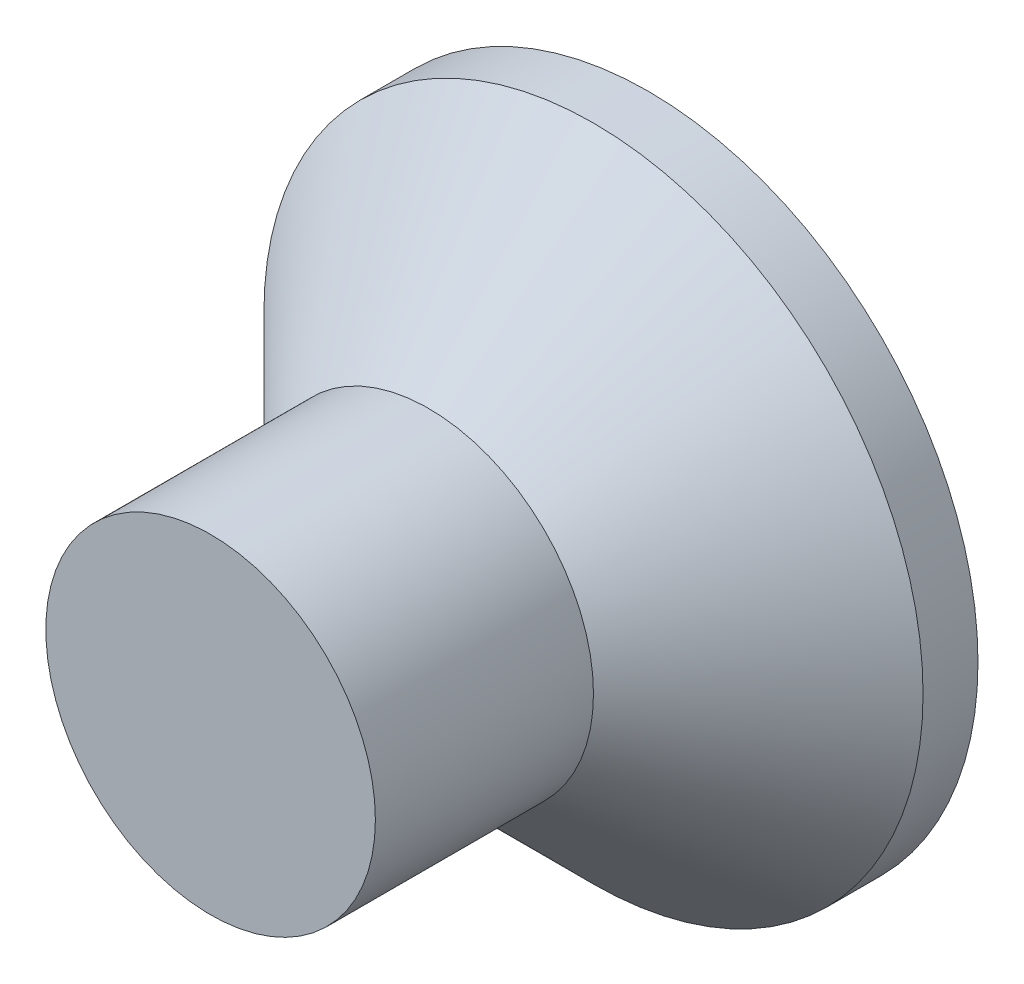
ISO-10303-21;
HEADER;
FILE_DESCRIPTION(('STEP AP214'),'2;1');
FILE_NAME('part.step','',(''),(''),'','','');
FILE_SCHEMA(('AUTOMOTIVE_DESIGN { 1 0 10303 214 1 1 1 1 }'));
ENDSEC;
DATA;
#1=APPLICATION_CONTEXT('core data for automotive mechanical design processes');
#2=APPLICATION_PROTOCOL_DEFINITION('international standard','automotive_design',2000,#1);
#3=PRODUCT_CONTEXT('',#1,'mechanical');
#4=PRODUCT('Part','Part','',(#3));
#5=PRODUCT_RELATED_PRODUCT_CATEGORY('part','',(#4));
#6=PRODUCT_DEFINITION_FORMATION('','',#4);
#7=PRODUCT_DEFINITION_CONTEXT('part definition',#1,'design');
#8=PRODUCT_DEFINITION('design','',#6,#7);
#9=PRODUCT_DEFINITION_SHAPE('','',#8);
#10=(LENGTH_UNIT() NAMED_UNIT(*) SI_UNIT(.MILLI.,.METRE.));
#11=(NAMED_UNIT(*) PLANE_ANGLE_UNIT() SI_UNIT($,.RADIAN.));
#12=(NAMED_UNIT(*) SI_UNIT($,.STERADIAN.) SOLID_ANGLE_UNIT());
#13=UNCERTAINTY_MEASURE_WITH_UNIT(LENGTH_MEASURE(1.E-05),#10,'distance_accuracy_value','');
#14=(GEOMETRIC_REPRESENTATION_CONTEXT(3) GLOBAL_UNCERTAINTY_ASSIGNED_CONTEXT((#13)) GLOBAL_UNIT_ASSIGNED_CONTEXT((#10,
#11,#12)) REPRESENTATION_CONTEXT('',''));
#15=CARTESIAN_POINT('',(0.,0.,0.));
#16=DIRECTION('',(0.,0.,1.));
#17=DIRECTION('',(1.,0.,0.));
#18=AXIS2_PLACEMENT_3D('',#15,#16,#17);
#19=CARTESIAN_POINT('',(0.,0.,6.95286377859827));
#20=DIRECTION('',(0.,0.,1.));
#21=DIRECTION('',(1.,0.,0.));
#22=AXIS2_PLACEMENT_3D('',#19,#20,#21);
#23=SPHERICAL_SURFACE('',#22,7.57247084667507);
#24=CARTESIAN_POINT('',(0.,0.,0.));
#25=DIRECTION('',(0.,0.,1.));
#26=DIRECTION('',(1.,0.,0.));
#27=AXIS2_PLACEMENT_3D('',#24,#25,#26);
#28=CIRCLE('',#27,3.);
#29=CARTESIAN_POINT('',(3.,0.,0.));
#30=VERTEX_POINT('',#29);
#31=EDGE_CURVE('E183',#30,#30,#28,.T.);
#32=ORIENTED_EDGE('',*,*,#31,.F.);
#33=EDGE_LOOP('',(#32));
#34=FACE_BOUND('',#33,.T.);
#35=CARTESIAN_POINT('',(0.,-1.29903810567666,6.95286377859827));
#36=DIRECTION('',(0.,1.,0.));
#37=DIRECTION('',(0.,0.,1.));
#38=AXIS2_PLACEMENT_3D('',#35,#36,#37);
#39=CIRCLE('',#38,7.46021546094641);
#40=CARTESIAN_POINT('',(-0.750000000000001,-1.29903810567666,-0.469555956484341));
#41=VERTEX_POINT('',#40);
#42=CARTESIAN_POINT('',(0.750000000000001,-1.29903810567666,-0.469555956484341));
#43=VERTEX_POINT('',#42);
#44=EDGE_CURVE('E113',#41,#43,#39,.F.);
#45=ORIENTED_EDGE('',*,*,#44,.T.);
#46=CARTESIAN_POINT('',(1.125,-0.649519052838329,6.95286377859827));
#47=DIRECTION('',(-0.866025403784439,0.5,0.));
#48=DIRECTION('',(-0.5,-0.866025403784439,0.));
#49=AXIS2_PLACEMENT_3D('',#46,#47,#48);
#50=CIRCLE('',#49,7.46021546094641);
#51=CARTESIAN_POINT('',(1.5,0.,-0.469555956484341));
#52=VERTEX_POINT('',#51);
#53=EDGE_CURVE('E132',#43,#52,#50,.F.);
#54=ORIENTED_EDGE('',*,*,#53,.T.);
#55=CARTESIAN_POINT('',(1.125,0.64951905283833,6.95286377859827));
#56=DIRECTION('',(-0.866025403784439,-0.5,0.));
#57=DIRECTION('',(0.5,-0.866025403784439,0.));
#58=AXIS2_PLACEMENT_3D('',#55,#56,#57);
#59=CIRCLE('',#58,7.46021546094641);
#60=CARTESIAN_POINT('',(0.75,1.29903810567666,-0.469555956484341));
#61=VERTEX_POINT('',#60);
#62=EDGE_CURVE('E129',#52,#61,#59,.F.);
#63=ORIENTED_EDGE('',*,*,#62,.T.);
#64=CARTESIAN_POINT('',(0.,1.29903810567666,6.95286377859827));
#65=DIRECTION('',(0.,-1.,0.));
#66=DIRECTION('',(0.,0.,-1.));
#67=AXIS2_PLACEMENT_3D('',#64,#65,#66);
#68=CIRCLE('',#67,7.46021546094641);
#69=CARTESIAN_POINT('',(-0.75,1.29903810567666,-0.469555956484341));
#70=VERTEX_POINT('',#69);
#71=EDGE_CURVE('E124',#61,#70,#68,.F.);
#72=ORIENTED_EDGE('',*,*,#71,.T.);
#73=CARTESIAN_POINT('',(-1.125,0.649519052838329,6.95286377859827));
#74=DIRECTION('',(0.866025403784439,-0.5,0.));
#75=DIRECTION('',(0.5,0.866025403784439,0.));
#76=AXIS2_PLACEMENT_3D('',#73,#74,#75);
#77=CIRCLE('',#76,7.46021546094641);
#78=CARTESIAN_POINT('',(-1.5,0.,-0.469555956484341));
#79=VERTEX_POINT('',#78);
#80=EDGE_CURVE('E122',#70,#79,#77,.F.);
#81=ORIENTED_EDGE('',*,*,#80,.T.);
#82=CARTESIAN_POINT('',(-1.125,-0.649519052838329,6.95286377859827));
#83=DIRECTION('',(0.866025403784439,0.5,0.));
#84=DIRECTION('',(-0.5,0.866025403784439,0.));
#85=AXIS2_PLACEMENT_3D('',#82,#83,#84);
#86=CIRCLE('',#85,7.46021546094641);
#87=EDGE_CURVE('E106',#79,#41,#86,.F.);
#88=ORIENTED_EDGE('',*,*,#87,.T.);
#89=EDGE_LOOP('',(#45,#54,#63,#72,#81,#88));
#90=FACE_BOUND('',#89,.T.);
#91=ADVANCED_FACE('F32',(#34,#90),#23,.T.);
#92=CARTESIAN_POINT('',(1.5,0.,3.98507993451573));
#93=DIRECTION('',(0.,0.,1.));
#94=DIRECTION('',(1.,0.,0.));
#95=AXIS2_PLACEMENT_3D('',#92,#93,#94);
#96=PLANE('',#95);
#97=CARTESIAN_POINT('',(0.,0.,3.98507993451573));
#98=DIRECTION('',(0.,0.,1.));
#99=DIRECTION('',(1.,0.,0.));
#100=AXIS2_PLACEMENT_3D('',#97,#98,#99);
#101=CIRCLE('',#100,1.5);
#102=CARTESIAN_POINT('',(1.5,0.,3.98507993451573));
#103=VERTEX_POINT('',#102);
#104=EDGE_CURVE('E118',#103,#103,#101,.T.);
#105=ORIENTED_EDGE('',*,*,#104,.T.);
#106=EDGE_LOOP('',(#105));
#107=FACE_BOUND('',#106,.T.);
#108=ADVANCED_FACE('F194',(#107),#96,.T.);
#109=CARTESIAN_POINT('',(0.,0.,3.98507993451573));
#110=DIRECTION('',(0.,0.,1.));
#111=DIRECTION('',(1.,0.,0.));
#112=AXIS2_PLACEMENT_3D('',#109,#110,#111);
#113=CYLINDRICAL_SURFACE('',#112,1.5);
#114=CARTESIAN_POINT('',(0.,0.,1.99999999999998));
#115=DIRECTION('',(0.,0.,1.));
#116=DIRECTION('',(1.,0.,0.));
#117=AXIS2_PLACEMENT_3D('',#114,#115,#116);
#118=CIRCLE('',#117,1.5);
#119=CARTESIAN_POINT('',(1.5,0.,1.99999999999998));
#120=VERTEX_POINT('',#119);
#121=EDGE_CURVE('E189',#120,#120,#118,.T.);
#122=ORIENTED_EDGE('',*,*,#121,.T.);
#123=EDGE_LOOP('',(#122));
#124=FACE_BOUND('',#123,.T.);
#125=ORIENTED_EDGE('',*,*,#104,.F.);
#126=EDGE_LOOP('',(#125));
#127=FACE_BOUND('',#126,.T.);
#128=ADVANCED_FACE('F196',(#124,#127),#113,.T.);
#129=CARTESIAN_POINT('',(0.,0.,1.99999999999998));
#130=DIRECTION('',(0.,0.,-1.));
#131=DIRECTION('',(-1.,0.,0.));
#132=AXIS2_PLACEMENT_3D('',#129,#130,#131);
#133=CONICAL_SURFACE('',#132,1.5,0.785398163397454);
#134=CARTESIAN_POINT('',(0.,0.,0.5));
#135=DIRECTION('',(0.,0.,1.));
#136=DIRECTION('',(1.,0.,0.));
#137=AXIS2_PLACEMENT_3D('',#134,#135,#136);
#138=CIRCLE('',#137,3.);
#139=CARTESIAN_POINT('',(3.,0.,0.5));
#140=VERTEX_POINT('',#139);
#141=EDGE_CURVE('E186',#140,#140,#138,.T.);
#142=ORIENTED_EDGE('',*,*,#141,.T.);
#143=EDGE_LOOP('',(#142));
#144=FACE_BOUND('',#143,.T.);
#145=ORIENTED_EDGE('',*,*,#121,.F.);
#146=EDGE_LOOP('',(#145));
#147=FACE_BOUND('',#146,.T.);
#148=ADVANCED_FACE('F198',(#144,#147),#133,.T.);
#149=CARTESIAN_POINT('',(0.,0.,3.98507993451573));
#150=DIRECTION('',(0.,0.,1.));
#151=DIRECTION('',(1.,0.,0.));
#152=AXIS2_PLACEMENT_3D('',#149,#150,#151);
#153=CYLINDRICAL_SURFACE('',#152,3.);
#154=ORIENTED_EDGE('',*,*,#31,.T.);
#155=EDGE_LOOP('',(#154));
#156=FACE_BOUND('',#155,.T.);
#157=ORIENTED_EDGE('',*,*,#141,.F.);
#158=EDGE_LOOP('',(#157));
#159=FACE_BOUND('',#158,.T.);
#160=ADVANCED_FACE('F205',(#156,#159),#153,.T.);
#161=CARTESIAN_POINT('',(0.750000000000001,-1.29903810567666,0.380392931923203));
#162=DIRECTION('',(-0.866025403784439,0.5,0.));
#163=DIRECTION('',(-0.5,-0.866025403784439,0.));
#164=AXIS2_PLACEMENT_3D('',#161,#162,#163);
#165=PLANE('',#164);
#166=DIRECTION('',(0.,0.,-1.));
#167=VECTOR('',#166,1.);
#168=CARTESIAN_POINT('',(0.750000000000001,-1.29903810567666,0.380392931923203));
#169=LINE('',#168,#167);
#170=CARTESIAN_POINT('',(0.750000000000001,-1.29903810567666,0.0803929319232013));
#171=VERTEX_POINT('',#170);
#172=EDGE_CURVE('E110',#171,#43,#169,.T.);
#173=ORIENTED_EDGE('',*,*,#172,.F.);
#174=DIRECTION('',(0.5,0.866025403784439,0.));
#175=VECTOR('',#174,1.);
#176=CARTESIAN_POINT('',(0.750000000000001,-1.29903810567666,0.0803929319232013));
#177=LINE('',#176,#175);
#178=CARTESIAN_POINT('',(1.5,0.,0.0803929319232013));
#179=VERTEX_POINT('',#178);
#180=EDGE_CURVE('E11',#171,#179,#177,.T.);
#181=ORIENTED_EDGE('',*,*,#180,.T.);
#182=DIRECTION('',(0.,0.,-1.));
#183=VECTOR('',#182,1.);
#184=CARTESIAN_POINT('',(1.5,0.,0.380392931923203));
#185=LINE('',#184,#183);
#186=EDGE_CURVE('E181',#179,#52,#185,.T.);
#187=ORIENTED_EDGE('',*,*,#186,.T.);
#188=ORIENTED_EDGE('',*,*,#53,.F.);
#189=EDGE_LOOP('',(#173,#181,#187,#188));
#190=FACE_BOUND('',#189,.T.);
#191=ADVANCED_FACE('F253',(#190),#165,.T.);
#192=CARTESIAN_POINT('',(1.5,0.,0.380392931923203));
#193=DIRECTION('',(-0.866025403784439,-0.5,0.));
#194=DIRECTION('',(0.5,-0.866025403784439,0.));
#195=AXIS2_PLACEMENT_3D('',#192,#193,#194);
#196=PLANE('',#195);
#197=ORIENTED_EDGE('',*,*,#186,.F.);
#198=DIRECTION('',(-0.5,0.866025403784439,0.));
#199=VECTOR('',#198,1.);
#200=CARTESIAN_POINT('',(1.5,0.,0.0803929319232013));
#201=LINE('',#200,#199);
#202=CARTESIAN_POINT('',(0.75,1.29903810567666,0.0803929319232013));
#203=VERTEX_POINT('',#202);
#204=EDGE_CURVE('E134',#179,#203,#201,.T.);
#205=ORIENTED_EDGE('',*,*,#204,.T.);
#206=DIRECTION('',(0.,0.,-1.));
#207=VECTOR('',#206,1.);
#208=CARTESIAN_POINT('',(0.75,1.29903810567666,0.380392931923203));
#209=LINE('',#208,#207);
#210=EDGE_CURVE('E179',#203,#61,#209,.T.);
#211=ORIENTED_EDGE('',*,*,#210,.T.);
#212=ORIENTED_EDGE('',*,*,#62,.F.);
#213=EDGE_LOOP('',(#197,#205,#211,#212));
#214=FACE_BOUND('',#213,.T.);
#215=ADVANCED_FACE('F256',(#214),#196,.T.);
#216=CARTESIAN_POINT('',(0.75,1.29903810567666,0.380392931923203));
#217=DIRECTION('',(0.,-1.,0.));
#218=DIRECTION('',(0.,0.,-1.));
#219=AXIS2_PLACEMENT_3D('',#216,#217,#218);
#220=PLANE('',#219);
#221=ORIENTED_EDGE('',*,*,#210,.F.);
#222=DIRECTION('',(-1.,0.,0.));
#223=VECTOR('',#222,1.);
#224=CARTESIAN_POINT('',(0.75,1.29903810567666,0.0803929319232013));
#225=LINE('',#224,#223);
#226=CARTESIAN_POINT('',(-0.75,1.29903810567666,0.0803929319232011));
#227=VERTEX_POINT('',#226);
#228=EDGE_CURVE('E150',#203,#227,#225,.T.);
#229=ORIENTED_EDGE('',*,*,#228,.T.);
#230=DIRECTION('',(0.,0.,-1.));
#231=VECTOR('',#230,1.);
#232=CARTESIAN_POINT('',(-0.75,1.29903810567666,0.380392931923203));
#233=LINE('',#232,#231);
#234=EDGE_CURVE('E177',#227,#70,#233,.T.);
#235=ORIENTED_EDGE('',*,*,#234,.T.);
#236=ORIENTED_EDGE('',*,*,#71,.F.);
#237=EDGE_LOOP('',(#221,#229,#235,#236));
#238=FACE_BOUND('',#237,.T.);
#239=ADVANCED_FACE('F260',(#238),#220,.T.);
#240=CARTESIAN_POINT('',(-0.75,1.29903810567666,0.380392931923203));
#241=DIRECTION('',(0.866025403784439,-0.5,0.));
#242=DIRECTION('',(0.5,0.866025403784439,0.));
#243=AXIS2_PLACEMENT_3D('',#240,#241,#242);
#244=PLANE('',#243);
#245=ORIENTED_EDGE('',*,*,#234,.F.);
#246=DIRECTION('',(-0.5,-0.866025403784439,0.));
#247=VECTOR('',#246,1.);
#248=CARTESIAN_POINT('',(-0.75,1.29903810567666,0.0803929319232011));
#249=LINE('',#248,#247);
#250=CARTESIAN_POINT('',(-1.5,0.,0.0803929319232013));
#251=VERTEX_POINT('',#250);
#252=EDGE_CURVE('E152',#227,#251,#249,.T.);
#253=ORIENTED_EDGE('',*,*,#252,.T.);
#254=DIRECTION('',(0.,0.,-1.));
#255=VECTOR('',#254,1.);
#256=CARTESIAN_POINT('',(-1.5,0.,0.380392931923203));
#257=LINE('',#256,#255);
#258=EDGE_CURVE('E109',#251,#79,#257,.T.);
#259=ORIENTED_EDGE('',*,*,#258,.T.);
#260=ORIENTED_EDGE('',*,*,#80,.F.);
#261=EDGE_LOOP('',(#245,#253,#259,#260));
#262=FACE_BOUND('',#261,.T.);
#263=ADVANCED_FACE('F264',(#262),#244,.T.);
#264=CARTESIAN_POINT('',(-1.5,0.,0.380392931923203));
#265=DIRECTION('',(0.866025403784439,0.5,0.));
#266=DIRECTION('',(-0.5,0.866025403784439,0.));
#267=AXIS2_PLACEMENT_3D('',#264,#265,#266);
#268=PLANE('',#267);
#269=ORIENTED_EDGE('',*,*,#258,.F.);
#270=DIRECTION('',(0.5,-0.866025403784439,0.));
#271=VECTOR('',#270,1.);
#272=CARTESIAN_POINT('',(-1.5,0.,0.0803929319232013));
#273=LINE('',#272,#271);
#274=CARTESIAN_POINT('',(-0.750000000000001,-1.29903810567666,0.0803929319232013));
#275=VERTEX_POINT('',#274);
#276=EDGE_CURVE('E56',#251,#275,#273,.T.);
#277=ORIENTED_EDGE('',*,*,#276,.T.);
#278=DIRECTION('',(0.,0.,-1.));
#279=VECTOR('',#278,1.);
#280=CARTESIAN_POINT('',(-0.750000000000001,-1.29903810567666,0.380392931923203));
#281=LINE('',#280,#279);
#282=EDGE_CURVE('E102',#275,#41,#281,.T.);
#283=ORIENTED_EDGE('',*,*,#282,.T.);
#284=ORIENTED_EDGE('',*,*,#87,.F.);
#285=EDGE_LOOP('',(#269,#277,#283,#284));
#286=FACE_BOUND('',#285,.T.);
#287=ADVANCED_FACE('F104',(#286),#268,.T.);
#288=CARTESIAN_POINT('',(-0.750000000000001,-1.29903810567666,0.380392931923203));
#289=DIRECTION('',(0.,1.,0.));
#290=DIRECTION('',(0.,0.,1.));
#291=AXIS2_PLACEMENT_3D('',#288,#289,#290);
#292=PLANE('',#291);
#293=ORIENTED_EDGE('',*,*,#282,.F.);
#294=DIRECTION('',(1.,0.,0.));
#295=VECTOR('',#294,1.);
#296=CARTESIAN_POINT('',(-0.750000000000001,-1.29903810567666,0.0803929319232013));
#297=LINE('',#296,#295);
#298=EDGE_CURVE('E41',#275,#171,#297,.T.);
#299=ORIENTED_EDGE('',*,*,#298,.T.);
#300=ORIENTED_EDGE('',*,*,#172,.T.);
#301=ORIENTED_EDGE('',*,*,#44,.F.);
#302=EDGE_LOOP('',(#293,#299,#300,#301));
#303=FACE_BOUND('',#302,.T.);
#304=ADVANCED_FACE('F114',(#303),#292,.T.);
#305=CARTESIAN_POINT('',(0.,0.,0.380392931923203));
#306=DIRECTION('',(0.,0.,1.));
#307=DIRECTION('',(1.,0.,0.));
#308=AXIS2_PLACEMENT_3D('',#305,#306,#307);
#309=PLANE('',#308);
#310=DIRECTION('',(1.,0.,0.));
#311=VECTOR('',#310,1.);
#312=CARTESIAN_POINT('',(0.,0.99903810567666,0.380392931923203));
#313=LINE('',#312,#311);
#314=CARTESIAN_POINT('',(-0.576794919243113,0.99903810567666,0.380392931923203));
#315=VERTEX_POINT('',#314);
#316=CARTESIAN_POINT('',(0.576794919243113,0.99903810567666,0.380392931923203));
#317=VERTEX_POINT('',#316);
#318=EDGE_CURVE('E145',#315,#317,#313,.T.);
#319=ORIENTED_EDGE('',*,*,#318,.T.);
#320=DIRECTION('',(0.5,-0.866025403784439,0.));
#321=VECTOR('',#320,1.);
#322=CARTESIAN_POINT('',(0.86519237886467,0.49951905283833,0.380392931923203));
#323=LINE('',#322,#321);
#324=CARTESIAN_POINT('',(1.15358983848623,0.,0.380392931923203));
#325=VERTEX_POINT('',#324);
#326=EDGE_CURVE('E147',#317,#325,#323,.T.);
#327=ORIENTED_EDGE('',*,*,#326,.T.);
#328=DIRECTION('',(-0.5,-0.866025403784439,0.));
#329=VECTOR('',#328,1.);
#330=CARTESIAN_POINT('',(0.86519237886467,-0.499519052838329,0.380392931923203));
#331=LINE('',#330,#329);
#332=CARTESIAN_POINT('',(0.576794919243113,-0.99903810567666,0.380392931923203));
#333=VERTEX_POINT('',#332);
#334=EDGE_CURVE('E137',#325,#333,#331,.T.);
#335=ORIENTED_EDGE('',*,*,#334,.T.);
#336=DIRECTION('',(-1.,0.,0.));
#337=VECTOR('',#336,1.);
#338=CARTESIAN_POINT('',(0.,-0.99903810567666,0.380392931923203));
#339=LINE('',#338,#337);
#340=CARTESIAN_POINT('',(-0.576794919243114,-0.99903810567666,0.380392931923203));
#341=VERTEX_POINT('',#340);
#342=EDGE_CURVE('E139',#333,#341,#339,.T.);
#343=ORIENTED_EDGE('',*,*,#342,.T.);
#344=DIRECTION('',(-0.5,0.866025403784439,0.));
#345=VECTOR('',#344,1.);
#346=CARTESIAN_POINT('',(-0.86519237886467,-0.49951905283833,0.380392931923203));
#347=LINE('',#346,#345);
#348=CARTESIAN_POINT('',(-1.15358983848623,0.,0.380392931923203));
#349=VERTEX_POINT('',#348);
#350=EDGE_CURVE('E141',#341,#349,#347,.T.);
#351=ORIENTED_EDGE('',*,*,#350,.T.);
#352=DIRECTION('',(0.5,0.866025403784439,0.));
#353=VECTOR('',#352,1.);
#354=CARTESIAN_POINT('',(-0.86519237886467,0.49951905283833,0.380392931923203));
#355=LINE('',#354,#353);
#356=EDGE_CURVE('E143',#349,#315,#355,.T.);
#357=ORIENTED_EDGE('',*,*,#356,.T.);
#358=EDGE_LOOP('',(#319,#327,#335,#343,#351,#357));
#359=FACE_BOUND('',#358,.T.);
#360=ADVANCED_FACE('F235',(#359),#309,.F.);
#361=CARTESIAN_POINT('',(-1.5,0.,0.0803929319232013));
#362=DIRECTION('',(-0.612372435695798,-0.353553390593276,0.707106781186544));
#363=DIRECTION('',(0.5,-0.866025403784439,0.));
#364=AXIS2_PLACEMENT_3D('',#361,#362,#363);
#365=PLANE('',#364);
#366=DIRECTION('',(0.755928946018451,0.,0.654653670707981));
#367=VECTOR('',#366,1.);
#368=CARTESIAN_POINT('',(-1.07142857142858,0.,0.451546676402247));
#369=LINE('',#368,#367);
#370=EDGE_CURVE('E165',#349,#251,#369,.F.);
#371=ORIENTED_EDGE('',*,*,#370,.F.);
#372=ORIENTED_EDGE('',*,*,#350,.F.);
#373=DIRECTION('',(0.377964473009226,0.654653670707974,0.654653670707981));
#374=VECTOR('',#373,1.);
#375=CARTESIAN_POINT('',(-0.535714285714288,-0.927884361197617,0.451546676402247));
#376=LINE('',#375,#374);
#377=EDGE_CURVE('E36',#275,#341,#376,.T.);
#378=ORIENTED_EDGE('',*,*,#377,.F.);
#379=ORIENTED_EDGE('',*,*,#276,.F.);
#380=EDGE_LOOP('',(#371,#372,#378,#379));
#381=FACE_BOUND('',#380,.T.);
#382=ADVANCED_FACE('F34',(#381),#365,.F.);
#383=CARTESIAN_POINT('',(-0.750000000000001,-1.29903810567666,0.0803929319232013));
#384=DIRECTION('',(0.,-0.707106781186551,0.707106781186544));
#385=DIRECTION('',(1.,0.,0.));
#386=AXIS2_PLACEMENT_3D('',#383,#384,#385);
#387=PLANE('',#386);
#388=ORIENTED_EDGE('',*,*,#377,.T.);
#389=ORIENTED_EDGE('',*,*,#342,.F.);
#390=DIRECTION('',(-0.377964473009226,0.654653670707974,0.654653670707981));
#391=VECTOR('',#390,1.);
#392=CARTESIAN_POINT('',(0.535714285714287,-0.927884361197616,0.451546676402248));
#393=LINE('',#392,#391);
#394=EDGE_CURVE('E163',#171,#333,#393,.T.);
#395=ORIENTED_EDGE('',*,*,#394,.F.);
#396=ORIENTED_EDGE('',*,*,#298,.F.);
#397=EDGE_LOOP('',(#388,#389,#395,#396));
#398=FACE_BOUND('',#397,.T.);
#399=ADVANCED_FACE('F230',(#398),#387,.F.);
#400=CARTESIAN_POINT('',(-0.75,1.29903810567666,0.0803929319232013));
#401=DIRECTION('',(-0.612372435695797,0.353553390593275,0.707106781186544));
#402=DIRECTION('',(-0.5,-0.866025403784439,0.));
#403=AXIS2_PLACEMENT_3D('',#400,#401,#402);
#404=PLANE('',#403);
#405=ORIENTED_EDGE('',*,*,#370,.T.);
#406=ORIENTED_EDGE('',*,*,#252,.F.);
#407=DIRECTION('',(0.377964473009226,-0.654653670707974,0.654653670707981));
#408=VECTOR('',#407,1.);
#409=CARTESIAN_POINT('',(-0.535714285714287,0.927884361197616,0.451546676402247));
#410=LINE('',#409,#408);
#411=EDGE_CURVE('E160',#315,#227,#410,.F.);
#412=ORIENTED_EDGE('',*,*,#411,.F.);
#413=ORIENTED_EDGE('',*,*,#356,.F.);
#414=EDGE_LOOP('',(#405,#406,#412,#413));
#415=FACE_BOUND('',#414,.T.);
#416=ADVANCED_FACE('F227',(#415),#404,.F.);
#417=CARTESIAN_POINT('',(0.750000000000001,-1.29903810567666,0.0803929319232013));
#418=DIRECTION('',(0.612372435695798,-0.353553390593275,0.707106781186544));
#419=DIRECTION('',(0.5,0.866025403784439,0.));
#420=AXIS2_PLACEMENT_3D('',#417,#418,#419);
#421=PLANE('',#420);
#422=ORIENTED_EDGE('',*,*,#394,.T.);
#423=ORIENTED_EDGE('',*,*,#334,.F.);
#424=DIRECTION('',(0.755928946018451,0.,-0.654653670707981));
#425=VECTOR('',#424,1.);
#426=CARTESIAN_POINT('',(1.5,0.,0.0803929319232013));
#427=LINE('',#426,#425);
#428=EDGE_CURVE('E158',#179,#325,#427,.F.);
#429=ORIENTED_EDGE('',*,*,#428,.F.);
#430=ORIENTED_EDGE('',*,*,#180,.F.);
#431=EDGE_LOOP('',(#422,#423,#429,#430));
#432=FACE_BOUND('',#431,.T.);
#433=ADVANCED_FACE('F223',(#432),#421,.F.);
#434=CARTESIAN_POINT('',(0.75,1.29903810567666,0.0803929319232013));
#435=DIRECTION('',(0.,0.707106781186551,0.707106781186544));
#436=DIRECTION('',(-1.,0.,0.));
#437=AXIS2_PLACEMENT_3D('',#434,#435,#436);
#438=PLANE('',#437);
#439=ORIENTED_EDGE('',*,*,#411,.T.);
#440=ORIENTED_EDGE('',*,*,#228,.F.);
#441=DIRECTION('',(-0.377964473009226,-0.654653670707974,0.654653670707981));
#442=VECTOR('',#441,1.);
#443=CARTESIAN_POINT('',(0.535714285714287,0.927884361197617,0.451546676402246));
#444=LINE('',#443,#442);
#445=EDGE_CURVE('E156',#317,#203,#444,.F.);
#446=ORIENTED_EDGE('',*,*,#445,.F.);
#447=ORIENTED_EDGE('',*,*,#318,.F.);
#448=EDGE_LOOP('',(#439,#440,#446,#447));
#449=FACE_BOUND('',#448,.T.);
#450=ADVANCED_FACE('F219',(#449),#438,.F.);
#451=CARTESIAN_POINT('',(1.5,0.,0.0803929319232013));
#452=DIRECTION('',(0.612372435695797,0.353553390593276,0.707106781186544));
#453=DIRECTION('',(-0.5,0.866025403784439,0.));
#454=AXIS2_PLACEMENT_3D('',#451,#452,#453);
#455=PLANE('',#454);
#456=ORIENTED_EDGE('',*,*,#428,.T.);
#457=ORIENTED_EDGE('',*,*,#326,.F.);
#458=ORIENTED_EDGE('',*,*,#445,.T.);
#459=ORIENTED_EDGE('',*,*,#204,.F.);
#460=EDGE_LOOP('',(#456,#457,#458,#459));
#461=FACE_BOUND('',#460,.T.);
#462=ADVANCED_FACE('F216',(#461),#455,.F.);
#463=CLOSED_SHELL('',(#91,#108,#128,#148,#160,#191,#215,#239,#263,#287,#304,#360,#382,#399,#416,
#433,#450,#462));
#464=MANIFOLD_SOLID_BREP('B2',#463);
#465=ADVANCED_BREP_SHAPE_REPRESENTATION('',(#18,#464),#14);
#466=SHAPE_DEFINITION_REPRESENTATION(#9,#465);
ENDSEC;
END-ISO-10303-21;
